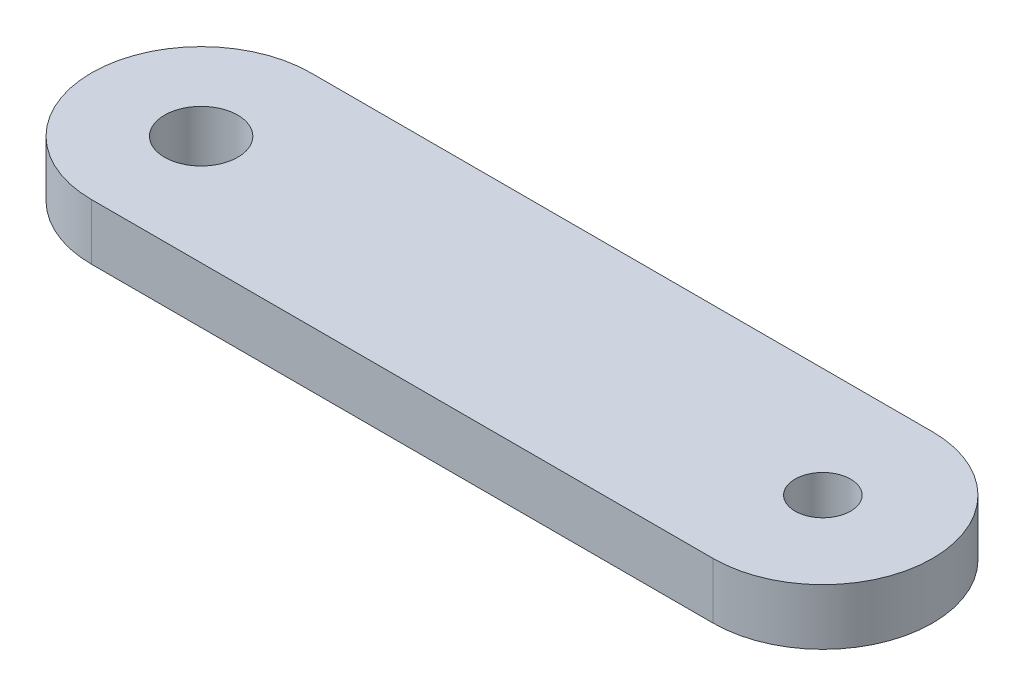
ISO-10303-21;
HEADER;
FILE_DESCRIPTION(('STEP AP214'),'2;1');
FILE_NAME('part.step','',(''),(''),'','','');
FILE_SCHEMA(('AUTOMOTIVE_DESIGN { 1 0 10303 214 1 1 1 1 }'));
ENDSEC;
DATA;
#1=APPLICATION_CONTEXT('core data for automotive mechanical design processes');
#2=APPLICATION_PROTOCOL_DEFINITION('international standard','automotive_design',2000,#1);
#3=PRODUCT_CONTEXT('',#1,'mechanical');
#4=PRODUCT('Part','Part','',(#3));
#5=PRODUCT_RELATED_PRODUCT_CATEGORY('part','',(#4));
#6=PRODUCT_DEFINITION_FORMATION('','',#4);
#7=PRODUCT_DEFINITION_CONTEXT('part definition',#1,'design');
#8=PRODUCT_DEFINITION('design','',#6,#7);
#9=PRODUCT_DEFINITION_SHAPE('','',#8);
#10=(LENGTH_UNIT() NAMED_UNIT(*) SI_UNIT(.MILLI.,.METRE.));
#11=(NAMED_UNIT(*) PLANE_ANGLE_UNIT() SI_UNIT($,.RADIAN.));
#12=(NAMED_UNIT(*) SI_UNIT($,.STERADIAN.) SOLID_ANGLE_UNIT());
#13=UNCERTAINTY_MEASURE_WITH_UNIT(LENGTH_MEASURE(1.E-05),#10,'distance_accuracy_value','');
#14=(GEOMETRIC_REPRESENTATION_CONTEXT(3) GLOBAL_UNCERTAINTY_ASSIGNED_CONTEXT((#13)) GLOBAL_UNIT_ASSIGNED_CONTEXT((#10,
#11,#12)) REPRESENTATION_CONTEXT('',''));
#15=CARTESIAN_POINT('',(0.,0.,0.));
#16=DIRECTION('',(0.,0.,1.));
#17=DIRECTION('',(1.,0.,0.));
#18=AXIS2_PLACEMENT_3D('',#15,#16,#17);
#19=CARTESIAN_POINT('',(-53.975,80.3329884574246,-9.525));
#20=DIRECTION('',(0.,0.,-1.));
#21=DIRECTION('',(-1.,0.,0.));
#22=AXIS2_PLACEMENT_3D('',#19,#20,#21);
#23=PLANE('',#22);
#24=DIRECTION('',(-1.,0.,0.));
#25=VECTOR('',#24,1.);
#26=CARTESIAN_POINT('',(-53.975,4.86409999999468,-9.525));
#27=LINE('',#26,#25);
#28=CARTESIAN_POINT('',(0.,4.86409999999468,-9.525));
#29=VERTEX_POINT('',#28);
#30=CARTESIAN_POINT('',(-53.975,4.86409999999468,-9.525));
#31=VERTEX_POINT('',#30);
#32=EDGE_CURVE('E40',#29,#31,#27,.T.);
#33=ORIENTED_EDGE('',*,*,#32,.F.);
#34=DIRECTION('',(0.,-1.,0.));
#35=VECTOR('',#34,1.);
#36=CARTESIAN_POINT('',(0.,80.3329884574246,-9.525));
#37=LINE('',#36,#35);
#38=CARTESIAN_POINT('',(0.,0.,-9.525));
#39=VERTEX_POINT('',#38);
#40=EDGE_CURVE('E69',#29,#39,#37,.T.);
#41=ORIENTED_EDGE('',*,*,#40,.T.);
#42=DIRECTION('',(1.,0.,0.));
#43=VECTOR('',#42,1.);
#44=CARTESIAN_POINT('',(-53.975,0.,-9.525));
#45=LINE('',#44,#43);
#46=CARTESIAN_POINT('',(-53.975,0.,-9.525));
#47=VERTEX_POINT('',#46);
#48=EDGE_CURVE('E73',#47,#39,#45,.T.);
#49=ORIENTED_EDGE('',*,*,#48,.F.);
#50=DIRECTION('',(0.,-1.,0.));
#51=VECTOR('',#50,1.);
#52=CARTESIAN_POINT('',(-53.975,80.3329884574246,-9.525));
#53=LINE('',#52,#51);
#54=EDGE_CURVE('E100',#31,#47,#53,.T.);
#55=ORIENTED_EDGE('',*,*,#54,.F.);
#56=EDGE_LOOP('',(#33,#41,#49,#55));
#57=FACE_BOUND('',#56,.T.);
#58=ADVANCED_FACE('F33',(#57),#23,.T.);
#59=CARTESIAN_POINT('',(-53.975,80.3329884574246,0.));
#60=DIRECTION('',(0.,-1.,0.));
#61=DIRECTION('',(0.,0.,-1.));
#62=AXIS2_PLACEMENT_3D('',#59,#60,#61);
#63=CYLINDRICAL_SURFACE('',#62,9.525);
#64=DIRECTION('',(0.,-1.,0.));
#65=VECTOR('',#64,1.);
#66=CARTESIAN_POINT('',(-53.975,80.3329884574246,9.525));
#67=LINE('',#66,#65);
#68=CARTESIAN_POINT('',(-53.975,4.86409999999468,9.525));
#69=VERTEX_POINT('',#68);
#70=CARTESIAN_POINT('',(-53.975,0.,9.525));
#71=VERTEX_POINT('',#70);
#72=EDGE_CURVE('E103',#69,#71,#67,.T.);
#73=ORIENTED_EDGE('',*,*,#72,.F.);
#74=CARTESIAN_POINT('',(-53.975,4.86409999999468,0.));
#75=DIRECTION('',(0.,-1.,0.));
#76=DIRECTION('',(1.,0.,0.));
#77=AXIS2_PLACEMENT_3D('',#74,#75,#76);
#78=CIRCLE('',#77,9.525);
#79=EDGE_CURVE('E47',#69,#31,#78,.T.);
#80=ORIENTED_EDGE('',*,*,#79,.T.);
#81=ORIENTED_EDGE('',*,*,#54,.T.);
#82=CARTESIAN_POINT('',(-53.975,0.,0.));
#83=DIRECTION('',(0.,1.,0.));
#84=DIRECTION('',(0.,0.,1.));
#85=AXIS2_PLACEMENT_3D('',#82,#83,#84);
#86=CIRCLE('',#85,9.525);
#87=EDGE_CURVE('E77',#47,#71,#86,.T.);
#88=ORIENTED_EDGE('',*,*,#87,.T.);
#89=EDGE_LOOP('',(#73,#80,#81,#88));
#90=FACE_BOUND('',#89,.T.);
#91=ADVANCED_FACE('F109',(#90),#63,.T.);
#92=CARTESIAN_POINT('',(-53.975,80.3329884574246,9.525));
#93=DIRECTION('',(0.,0.,-1.));
#94=DIRECTION('',(-1.,0.,0.));
#95=AXIS2_PLACEMENT_3D('',#92,#93,#94);
#96=PLANE('',#95);
#97=DIRECTION('',(0.,-1.,0.));
#98=VECTOR('',#97,1.);
#99=CARTESIAN_POINT('',(0.,80.3329884574246,9.525));
#100=LINE('',#99,#98);
#101=CARTESIAN_POINT('',(0.,4.86409999999468,9.525));
#102=VERTEX_POINT('',#101);
#103=CARTESIAN_POINT('',(0.,0.,9.525));
#104=VERTEX_POINT('',#103);
#105=EDGE_CURVE('E76',#102,#104,#100,.T.);
#106=ORIENTED_EDGE('',*,*,#105,.F.);
#107=DIRECTION('',(-1.,0.,0.));
#108=VECTOR('',#107,1.);
#109=CARTESIAN_POINT('',(-53.975,4.86409999999468,9.525));
#110=LINE('',#109,#108);
#111=EDGE_CURVE('E102',#102,#69,#110,.T.);
#112=ORIENTED_EDGE('',*,*,#111,.T.);
#113=ORIENTED_EDGE('',*,*,#72,.T.);
#114=DIRECTION('',(1.,0.,0.));
#115=VECTOR('',#114,1.);
#116=CARTESIAN_POINT('',(-53.975,0.,9.525));
#117=LINE('',#116,#115);
#118=EDGE_CURVE('E85',#71,#104,#117,.T.);
#119=ORIENTED_EDGE('',*,*,#118,.T.);
#120=EDGE_LOOP('',(#106,#112,#113,#119));
#121=FACE_BOUND('',#120,.T.);
#122=ADVANCED_FACE('F107',(#121),#96,.F.);
#123=CARTESIAN_POINT('',(0.,80.3329884574246,0.));
#124=DIRECTION('',(0.,-1.,0.));
#125=DIRECTION('',(0.,0.,-1.));
#126=AXIS2_PLACEMENT_3D('',#123,#124,#125);
#127=CYLINDRICAL_SURFACE('',#126,9.525);
#128=CARTESIAN_POINT('',(0.,4.86409999999468,0.));
#129=DIRECTION('',(0.,-1.,0.));
#130=DIRECTION('',(1.,0.,0.));
#131=AXIS2_PLACEMENT_3D('',#128,#129,#130);
#132=CIRCLE('',#131,9.525);
#133=EDGE_CURVE('E11',#102,#29,#132,.F.);
#134=ORIENTED_EDGE('',*,*,#133,.F.);
#135=ORIENTED_EDGE('',*,*,#105,.T.);
#136=CARTESIAN_POINT('',(0.,0.,0.));
#137=DIRECTION('',(0.,-1.,0.));
#138=DIRECTION('',(0.,0.,-1.));
#139=AXIS2_PLACEMENT_3D('',#136,#137,#138);
#140=CIRCLE('',#139,9.525);
#141=EDGE_CURVE('E79',#39,#104,#140,.T.);
#142=ORIENTED_EDGE('',*,*,#141,.F.);
#143=ORIENTED_EDGE('',*,*,#40,.F.);
#144=EDGE_LOOP('',(#134,#135,#142,#143));
#145=FACE_BOUND('',#144,.T.);
#146=ADVANCED_FACE('F80',(#145),#127,.T.);
#147=CARTESIAN_POINT('',(0.,0.,0.));
#148=DIRECTION('',(0.,-1.,0.));
#149=DIRECTION('',(0.,0.,-1.));
#150=AXIS2_PLACEMENT_3D('',#147,#148,#149);
#151=PLANE('',#150);
#152=CARTESIAN_POINT('',(-53.975,0.,0.));
#153=DIRECTION('',(0.,1.,0.));
#154=DIRECTION('',(0.,0.,1.));
#155=AXIS2_PLACEMENT_3D('',#152,#153,#154);
#156=CIRCLE('',#155,3.175);
#157=CARTESIAN_POINT('',(-53.975,0.,3.175));
#158=VERTEX_POINT('',#157);
#159=EDGE_CURVE('E90',#158,#158,#156,.T.);
#160=ORIENTED_EDGE('',*,*,#159,.T.);
#161=EDGE_LOOP('',(#160));
#162=FACE_BOUND('',#161,.T.);
#163=CARTESIAN_POINT('',(0.,0.,0.));
#164=DIRECTION('',(0.,1.,0.));
#165=DIRECTION('',(0.,0.,1.));
#166=AXIS2_PLACEMENT_3D('',#163,#164,#165);
#167=CIRCLE('',#166,2.41299999999998);
#168=CARTESIAN_POINT('',(0.,0.,2.41299999999997));
#169=VERTEX_POINT('',#168);
#170=EDGE_CURVE('E115',#169,#169,#167,.T.);
#171=ORIENTED_EDGE('',*,*,#170,.T.);
#172=EDGE_LOOP('',(#171));
#173=FACE_BOUND('',#172,.T.);
#174=ORIENTED_EDGE('',*,*,#48,.T.);
#175=ORIENTED_EDGE('',*,*,#141,.T.);
#176=ORIENTED_EDGE('',*,*,#118,.F.);
#177=ORIENTED_EDGE('',*,*,#87,.F.);
#178=EDGE_LOOP('',(#174,#175,#176,#177));
#179=FACE_BOUND('',#178,.T.);
#180=ADVANCED_FACE('F88',(#162,#173,#179),#151,.T.);
#181=CARTESIAN_POINT('',(-55.3683212971987,4.86409999999468,-1.39367825002037));
#182=DIRECTION('',(0.,-1.,0.));
#183=DIRECTION('',(-0.942241852864918,0.,-0.33493326306846));
#184=AXIS2_PLACEMENT_3D('',#181,#182,#183);
#185=PLANE('',#184);
#186=CARTESIAN_POINT('',(-53.975,4.86409999999468,0.));
#187=DIRECTION('',(0.,1.,0.));
#188=DIRECTION('',(0.,0.,1.));
#189=AXIS2_PLACEMENT_3D('',#186,#187,#188);
#190=CIRCLE('',#189,3.175);
#191=CARTESIAN_POINT('',(-53.975,4.86409999999468,3.175));
#192=VERTEX_POINT('',#191);
#193=EDGE_CURVE('E93',#192,#192,#190,.T.);
#194=ORIENTED_EDGE('',*,*,#193,.F.);
#195=EDGE_LOOP('',(#194));
#196=FACE_BOUND('',#195,.T.);
#197=CARTESIAN_POINT('',(0.,4.86409999999468,0.));
#198=DIRECTION('',(0.,1.,0.));
#199=DIRECTION('',(0.,0.,1.));
#200=AXIS2_PLACEMENT_3D('',#197,#198,#199);
#201=CIRCLE('',#200,2.41299999999998);
#202=CARTESIAN_POINT('',(0.,4.86409999999468,2.41299999999997));
#203=VERTEX_POINT('',#202);
#204=EDGE_CURVE('E112',#203,#203,#201,.T.);
#205=ORIENTED_EDGE('',*,*,#204,.F.);
#206=EDGE_LOOP('',(#205));
#207=FACE_BOUND('',#206,.T.);
#208=ORIENTED_EDGE('',*,*,#32,.T.);
#209=ORIENTED_EDGE('',*,*,#79,.F.);
#210=ORIENTED_EDGE('',*,*,#111,.F.);
#211=ORIENTED_EDGE('',*,*,#133,.T.);
#212=EDGE_LOOP('',(#208,#209,#210,#211));
#213=FACE_BOUND('',#212,.T.);
#214=ADVANCED_FACE('F123',(#196,#207,#213),#185,.F.);
#215=CARTESIAN_POINT('',(0.,0.,0.));
#216=DIRECTION('',(0.,1.,0.));
#217=DIRECTION('',(0.,0.,1.));
#218=AXIS2_PLACEMENT_3D('',#215,#216,#217);
#219=CYLINDRICAL_SURFACE('',#218,2.41299999999998);
#220=ORIENTED_EDGE('',*,*,#170,.F.);
#221=EDGE_LOOP('',(#220));
#222=FACE_BOUND('',#221,.T.);
#223=ORIENTED_EDGE('',*,*,#204,.T.);
#224=EDGE_LOOP('',(#223));
#225=FACE_BOUND('',#224,.T.);
#226=ADVANCED_FACE('F126',(#222,#225),#219,.F.);
#227=CARTESIAN_POINT('',(-53.975,0.,0.));
#228=DIRECTION('',(0.,1.,0.));
#229=DIRECTION('',(0.,0.,1.));
#230=AXIS2_PLACEMENT_3D('',#227,#228,#229);
#231=CYLINDRICAL_SURFACE('',#230,3.175);
#232=ORIENTED_EDGE('',*,*,#159,.F.);
#233=EDGE_LOOP('',(#232));
#234=FACE_BOUND('',#233,.T.);
#235=ORIENTED_EDGE('',*,*,#193,.T.);
#236=EDGE_LOOP('',(#235));
#237=FACE_BOUND('',#236,.T.);
#238=ADVANCED_FACE('F121',(#234,#237),#231,.F.);
#239=CLOSED_SHELL('',(#58,#91,#122,#146,#180,#214,#226,#238));
#240=MANIFOLD_SOLID_BREP('B2',#239);
#241=ADVANCED_BREP_SHAPE_REPRESENTATION('',(#18,#240),#14);
#242=SHAPE_DEFINITION_REPRESENTATION(#9,#241);
ENDSEC;
END-ISO-10303-21;
